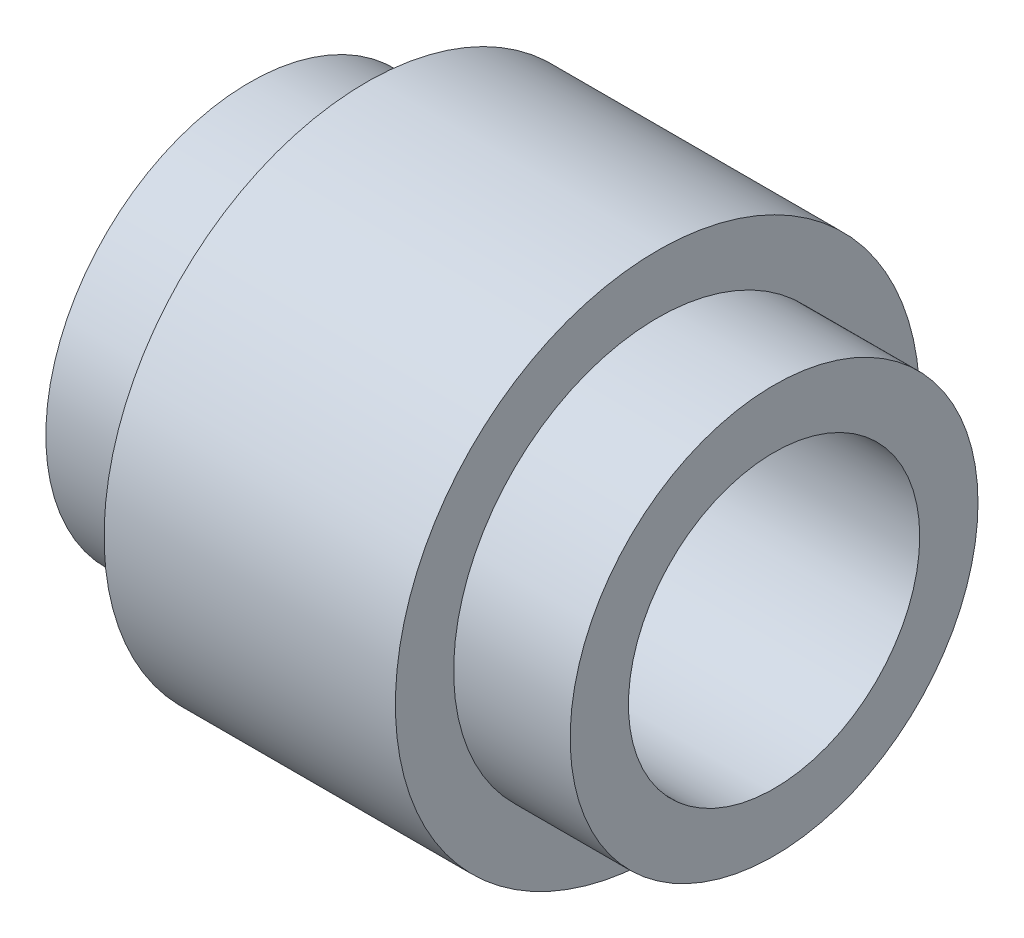
ISO-10303-21;
HEADER;
FILE_DESCRIPTION(('STEP AP214'),'2;1');
FILE_NAME('part.step','',(''),(''),'','','');
FILE_SCHEMA(('AUTOMOTIVE_DESIGN { 1 0 10303 214 1 1 1 1 }'));
ENDSEC;
DATA;
#1=APPLICATION_CONTEXT('core data for automotive mechanical design processes');
#2=APPLICATION_PROTOCOL_DEFINITION('international standard','automotive_design',2000,#1);
#3=PRODUCT_CONTEXT('',#1,'mechanical');
#4=PRODUCT('Part','Part','',(#3));
#5=PRODUCT_RELATED_PRODUCT_CATEGORY('part','',(#4));
#6=PRODUCT_DEFINITION_FORMATION('','',#4);
#7=PRODUCT_DEFINITION_CONTEXT('part definition',#1,'design');
#8=PRODUCT_DEFINITION('design','',#6,#7);
#9=PRODUCT_DEFINITION_SHAPE('','',#8);
#10=(LENGTH_UNIT() NAMED_UNIT(*) SI_UNIT(.MILLI.,.METRE.));
#11=(NAMED_UNIT(*) PLANE_ANGLE_UNIT() SI_UNIT($,.RADIAN.));
#12=(NAMED_UNIT(*) SI_UNIT($,.STERADIAN.) SOLID_ANGLE_UNIT());
#13=UNCERTAINTY_MEASURE_WITH_UNIT(LENGTH_MEASURE(1.E-05),#10,'distance_accuracy_value','');
#14=(GEOMETRIC_REPRESENTATION_CONTEXT(3) GLOBAL_UNCERTAINTY_ASSIGNED_CONTEXT((#13)) GLOBAL_UNIT_ASSIGNED_CONTEXT((#10,
#11,#12)) REPRESENTATION_CONTEXT('',''));
#15=CARTESIAN_POINT('',(0.,0.,0.));
#16=DIRECTION('',(0.,0.,1.));
#17=DIRECTION('',(1.,0.,0.));
#18=AXIS2_PLACEMENT_3D('',#15,#16,#17);
#19=CARTESIAN_POINT('',(63.5,0.,0.));
#20=DIRECTION('',(1.,0.,0.));
#21=DIRECTION('',(0.,0.,-1.));
#22=AXIS2_PLACEMENT_3D('',#19,#20,#21);
#23=PLANE('',#22);
#24=CARTESIAN_POINT('',(63.5,0.,0.));
#25=DIRECTION('',(1.,0.,0.));
#26=DIRECTION('',(0.,0.,-1.));
#27=AXIS2_PLACEMENT_3D('',#24,#25,#26);
#28=CIRCLE('',#27,114.3);
#29=CARTESIAN_POINT('',(63.5,0.,-114.3));
#30=VERTEX_POINT('',#29);
#31=EDGE_CURVE('E10',#30,#30,#28,.T.);
#32=ORIENTED_EDGE('',*,*,#31,.T.);
#33=EDGE_LOOP('',(#32));
#34=FACE_BOUND('',#33,.T.);
#35=CARTESIAN_POINT('',(63.5,0.,0.));
#36=DIRECTION('',(1.,0.,0.));
#37=DIRECTION('',(0.,0.,-1.));
#38=AXIS2_PLACEMENT_3D('',#35,#36,#37);
#39=CIRCLE('',#38,88.9);
#40=CARTESIAN_POINT('',(63.5,0.,-88.9));
#41=VERTEX_POINT('',#40);
#42=EDGE_CURVE('E48',#41,#41,#39,.T.);
#43=ORIENTED_EDGE('',*,*,#42,.F.);
#44=EDGE_LOOP('',(#43));
#45=FACE_BOUND('',#44,.T.);
#46=ADVANCED_FACE('F35',(#34,#45),#23,.T.);
#47=CARTESIAN_POINT('',(-63.5,0.,0.));
#48=DIRECTION('',(1.,0.,0.));
#49=DIRECTION('',(0.,0.,-1.));
#50=AXIS2_PLACEMENT_3D('',#47,#48,#49);
#51=PLANE('',#50);
#52=CARTESIAN_POINT('',(-63.5,0.,0.));
#53=DIRECTION('',(1.,0.,0.));
#54=DIRECTION('',(0.,0.,-1.));
#55=AXIS2_PLACEMENT_3D('',#52,#53,#54);
#56=CIRCLE('',#55,88.9);
#57=CARTESIAN_POINT('',(-63.5,0.,-88.9));
#58=VERTEX_POINT('',#57);
#59=EDGE_CURVE('E57',#58,#58,#56,.T.);
#60=ORIENTED_EDGE('',*,*,#59,.T.);
#61=EDGE_LOOP('',(#60));
#62=FACE_BOUND('',#61,.T.);
#63=CARTESIAN_POINT('',(-63.5,0.,0.));
#64=DIRECTION('',(1.,0.,0.));
#65=DIRECTION('',(0.,0.,-1.));
#66=AXIS2_PLACEMENT_3D('',#63,#64,#65);
#67=CIRCLE('',#66,114.3);
#68=CARTESIAN_POINT('',(-63.5,0.,-114.3));
#69=VERTEX_POINT('',#68);
#70=EDGE_CURVE('E39',#69,#69,#67,.T.);
#71=ORIENTED_EDGE('',*,*,#70,.F.);
#72=EDGE_LOOP('',(#71));
#73=FACE_BOUND('',#72,.T.);
#74=ADVANCED_FACE('F81',(#62,#73),#51,.F.);
#75=CARTESIAN_POINT('',(63.5,0.,0.));
#76=DIRECTION('',(-1.,0.,0.));
#77=DIRECTION('',(0.,0.,1.));
#78=AXIS2_PLACEMENT_3D('',#75,#76,#77);
#79=CYLINDRICAL_SURFACE('',#78,114.3);
#80=ORIENTED_EDGE('',*,*,#31,.F.);
#81=EDGE_LOOP('',(#80));
#82=FACE_BOUND('',#81,.T.);
#83=ORIENTED_EDGE('',*,*,#70,.T.);
#84=EDGE_LOOP('',(#83));
#85=FACE_BOUND('',#84,.T.);
#86=ADVANCED_FACE('F37',(#82,#85),#79,.T.);
#87=CARTESIAN_POINT('',(63.5,0.,0.));
#88=DIRECTION('',(-1.,0.,0.));
#89=DIRECTION('',(0.,0.,1.));
#90=AXIS2_PLACEMENT_3D('',#87,#88,#89);
#91=CYLINDRICAL_SURFACE('',#90,63.5);
#92=CARTESIAN_POINT('',(114.3,0.,0.));
#93=DIRECTION('',(1.,0.,0.));
#94=DIRECTION('',(0.,0.,-1.));
#95=AXIS2_PLACEMENT_3D('',#92,#93,#94);
#96=CIRCLE('',#95,63.5);
#97=CARTESIAN_POINT('',(114.3,0.,-63.5));
#98=VERTEX_POINT('',#97);
#99=EDGE_CURVE('E51',#98,#98,#96,.T.);
#100=ORIENTED_EDGE('',*,*,#99,.T.);
#101=EDGE_LOOP('',(#100));
#102=FACE_BOUND('',#101,.T.);
#103=CARTESIAN_POINT('',(-114.3,0.,0.));
#104=DIRECTION('',(1.,0.,0.));
#105=DIRECTION('',(0.,0.,-1.));
#106=AXIS2_PLACEMENT_3D('',#103,#104,#105);
#107=CIRCLE('',#106,63.5);
#108=CARTESIAN_POINT('',(-114.3,0.,-63.5));
#109=VERTEX_POINT('',#108);
#110=EDGE_CURVE('E60',#109,#109,#107,.T.);
#111=ORIENTED_EDGE('',*,*,#110,.F.);
#112=EDGE_LOOP('',(#111));
#113=FACE_BOUND('',#112,.T.);
#114=ADVANCED_FACE('F69',(#102,#113),#91,.F.);
#115=CARTESIAN_POINT('',(114.3,0.,0.));
#116=DIRECTION('',(1.,0.,0.));
#117=DIRECTION('',(0.,0.,-1.));
#118=AXIS2_PLACEMENT_3D('',#115,#116,#117);
#119=PLANE('',#118);
#120=CARTESIAN_POINT('',(114.3,0.,0.));
#121=DIRECTION('',(1.,0.,0.));
#122=DIRECTION('',(0.,0.,-1.));
#123=AXIS2_PLACEMENT_3D('',#120,#121,#122);
#124=CIRCLE('',#123,88.9);
#125=CARTESIAN_POINT('',(114.3,0.,-88.9));
#126=VERTEX_POINT('',#125);
#127=EDGE_CURVE('E46',#126,#126,#124,.T.);
#128=ORIENTED_EDGE('',*,*,#127,.T.);
#129=EDGE_LOOP('',(#128));
#130=FACE_BOUND('',#129,.T.);
#131=ORIENTED_EDGE('',*,*,#99,.F.);
#132=EDGE_LOOP('',(#131));
#133=FACE_BOUND('',#132,.T.);
#134=ADVANCED_FACE('F71',(#130,#133),#119,.T.);
#135=CARTESIAN_POINT('',(114.3,0.,0.));
#136=DIRECTION('',(-1.,0.,0.));
#137=DIRECTION('',(0.,0.,1.));
#138=AXIS2_PLACEMENT_3D('',#135,#136,#137);
#139=CYLINDRICAL_SURFACE('',#138,88.9);
#140=ORIENTED_EDGE('',*,*,#127,.F.);
#141=EDGE_LOOP('',(#140));
#142=FACE_BOUND('',#141,.T.);
#143=ORIENTED_EDGE('',*,*,#42,.T.);
#144=EDGE_LOOP('',(#143));
#145=FACE_BOUND('',#144,.T.);
#146=ADVANCED_FACE('F78',(#142,#145),#139,.T.);
#147=CARTESIAN_POINT('',(-114.3,0.,0.));
#148=DIRECTION('',(1.,0.,0.));
#149=DIRECTION('',(0.,0.,-1.));
#150=AXIS2_PLACEMENT_3D('',#147,#148,#149);
#151=CYLINDRICAL_SURFACE('',#150,88.9);
#152=CARTESIAN_POINT('',(-114.3,0.,0.));
#153=DIRECTION('',(1.,0.,0.));
#154=DIRECTION('',(0.,0.,-1.));
#155=AXIS2_PLACEMENT_3D('',#152,#153,#154);
#156=CIRCLE('',#155,88.9);
#157=CARTESIAN_POINT('',(-114.3,0.,-88.9));
#158=VERTEX_POINT('',#157);
#159=EDGE_CURVE('E56',#158,#158,#156,.T.);
#160=ORIENTED_EDGE('',*,*,#159,.T.);
#161=EDGE_LOOP('',(#160));
#162=FACE_BOUND('',#161,.T.);
#163=ORIENTED_EDGE('',*,*,#59,.F.);
#164=EDGE_LOOP('',(#163));
#165=FACE_BOUND('',#164,.T.);
#166=ADVANCED_FACE('F94',(#162,#165),#151,.T.);
#167=CARTESIAN_POINT('',(-114.3,0.,0.));
#168=DIRECTION('',(-1.,0.,0.));
#169=DIRECTION('',(0.,0.,-1.));
#170=AXIS2_PLACEMENT_3D('',#167,#168,#169);
#171=PLANE('',#170);
#172=ORIENTED_EDGE('',*,*,#110,.T.);
#173=EDGE_LOOP('',(#172));
#174=FACE_BOUND('',#173,.T.);
#175=ORIENTED_EDGE('',*,*,#159,.F.);
#176=EDGE_LOOP('',(#175));
#177=FACE_BOUND('',#176,.T.);
#178=ADVANCED_FACE('F66',(#174,#177),#171,.T.);
#179=CLOSED_SHELL('',(#46,#74,#86,#114,#134,#146,#166,#178));
#180=MANIFOLD_SOLID_BREP('B2',#179);
#181=ADVANCED_BREP_SHAPE_REPRESENTATION('',(#18,#180),#14);
#182=SHAPE_DEFINITION_REPRESENTATION(#9,#181);
ENDSEC;
END-ISO-10303-21;
